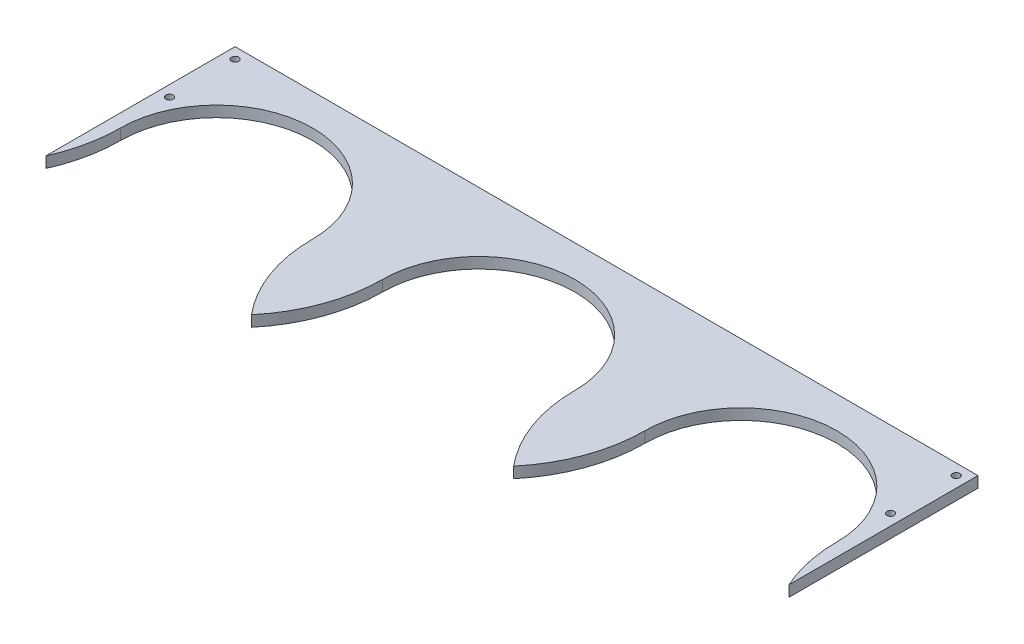
ISO-10303-21;
HEADER;
FILE_DESCRIPTION(('STEP AP214'),'2;1');
FILE_NAME('part.step','',(''),(''),'','','');
FILE_SCHEMA(('AUTOMOTIVE_DESIGN { 1 0 10303 214 1 1 1 1 }'));
ENDSEC;
DATA;
#1=APPLICATION_CONTEXT('core data for automotive mechanical design processes');
#2=APPLICATION_PROTOCOL_DEFINITION('international standard','automotive_design',2000,#1);
#3=PRODUCT_CONTEXT('',#1,'mechanical');
#4=PRODUCT('Part','Part','',(#3));
#5=PRODUCT_RELATED_PRODUCT_CATEGORY('part','',(#4));
#6=PRODUCT_DEFINITION_FORMATION('','',#4);
#7=PRODUCT_DEFINITION_CONTEXT('part definition',#1,'design');
#8=PRODUCT_DEFINITION('design','',#6,#7);
#9=PRODUCT_DEFINITION_SHAPE('','',#8);
#10=(LENGTH_UNIT() NAMED_UNIT(*) SI_UNIT(.MILLI.,.METRE.));
#11=(NAMED_UNIT(*) PLANE_ANGLE_UNIT() SI_UNIT($,.RADIAN.));
#12=(NAMED_UNIT(*) SI_UNIT($,.STERADIAN.) SOLID_ANGLE_UNIT());
#13=UNCERTAINTY_MEASURE_WITH_UNIT(LENGTH_MEASURE(1.E-05),#10,'distance_accuracy_value','');
#14=(GEOMETRIC_REPRESENTATION_CONTEXT(3) GLOBAL_UNCERTAINTY_ASSIGNED_CONTEXT((#13)) GLOBAL_UNIT_ASSIGNED_CONTEXT((#10,
#11,#12)) REPRESENTATION_CONTEXT('',''));
#15=CARTESIAN_POINT('',(0.,0.,0.));
#16=DIRECTION('',(0.,0.,1.));
#17=DIRECTION('',(1.,0.,0.));
#18=AXIS2_PLACEMENT_3D('',#15,#16,#17);
#19=CARTESIAN_POINT('',(76.2,-6.35,74.295));
#20=DIRECTION('',(0.,1.,0.));
#21=DIRECTION('',(0.,0.,1.));
#22=AXIS2_PLACEMENT_3D('',#19,#20,#21);
#23=CYLINDRICAL_SURFACE('',#22,55.88);
#24=CARTESIAN_POINT('',(76.2,0.,74.295));
#25=DIRECTION('',(0.,1.,0.));
#26=DIRECTION('',(0.,0.,1.));
#27=AXIS2_PLACEMENT_3D('',#24,#25,#26);
#28=CIRCLE('',#27,55.88);
#29=CARTESIAN_POINT('',(132.08,0.,74.295));
#30=VERTEX_POINT('',#29);
#31=CARTESIAN_POINT('',(20.32,0.,74.2949999999999));
#32=VERTEX_POINT('',#31);
#33=EDGE_CURVE('E170',#30,#32,#28,.T.);
#34=ORIENTED_EDGE('',*,*,#33,.T.);
#35=DIRECTION('',(0.,1.,0.));
#36=VECTOR('',#35,1.);
#37=CARTESIAN_POINT('',(20.32,-6.35,74.2949999999999));
#38=LINE('',#37,#36);
#39=CARTESIAN_POINT('',(20.32,-6.35,74.2949999999999));
#40=VERTEX_POINT('',#39);
#41=EDGE_CURVE('E11',#40,#32,#38,.T.);
#42=ORIENTED_EDGE('',*,*,#41,.F.);
#43=CARTESIAN_POINT('',(76.2,-6.35,74.295));
#44=DIRECTION('',(0.,1.,0.));
#45=DIRECTION('',(0.,0.,1.));
#46=AXIS2_PLACEMENT_3D('',#43,#44,#45);
#47=CIRCLE('',#46,55.88);
#48=CARTESIAN_POINT('',(132.08,-6.35,74.295));
#49=VERTEX_POINT('',#48);
#50=EDGE_CURVE('E54',#49,#40,#47,.T.);
#51=ORIENTED_EDGE('',*,*,#50,.F.);
#52=DIRECTION('',(0.,1.,0.));
#53=VECTOR('',#52,1.);
#54=CARTESIAN_POINT('',(132.08,-6.35,74.295));
#55=LINE('',#54,#53);
#56=EDGE_CURVE('E39',#49,#30,#55,.T.);
#57=ORIENTED_EDGE('',*,*,#56,.T.);
#58=EDGE_LOOP('',(#34,#42,#51,#57));
#59=FACE_BOUND('',#58,.T.);
#60=ADVANCED_FACE('F35',(#59),#23,.F.);
#61=CARTESIAN_POINT('',(-66.6750000000003,-6.35,74.2949999999999));
#62=DIRECTION('',(0.,1.,0.));
#63=DIRECTION('',(0.,0.,1.));
#64=AXIS2_PLACEMENT_3D('',#61,#62,#63);
#65=CYLINDRICAL_SURFACE('',#64,86.9950000000003);
#66=CARTESIAN_POINT('',(-66.6750000000003,0.,74.2949999999999));
#67=DIRECTION('',(0.,1.,0.));
#68=DIRECTION('',(0.,0.,1.));
#69=AXIS2_PLACEMENT_3D('',#66,#67,#68);
#70=CIRCLE('',#69,86.9950000000003);
#71=CARTESIAN_POINT('',(12.7,0.,109.900328252945));
#72=VERTEX_POINT('',#71);
#73=EDGE_CURVE('E198',#72,#32,#70,.T.);
#74=ORIENTED_EDGE('',*,*,#73,.F.);
#75=DIRECTION('',(0.,1.,0.));
#76=VECTOR('',#75,1.);
#77=CARTESIAN_POINT('',(12.7,-6.35,109.900328252945));
#78=LINE('',#77,#76);
#79=CARTESIAN_POINT('',(12.7,-6.35,109.900328252945));
#80=VERTEX_POINT('',#79);
#81=EDGE_CURVE('E45',#80,#72,#78,.T.);
#82=ORIENTED_EDGE('',*,*,#81,.F.);
#83=CARTESIAN_POINT('',(-66.6750000000003,-6.35,74.2949999999999));
#84=DIRECTION('',(0.,1.,0.));
#85=DIRECTION('',(0.,0.,1.));
#86=AXIS2_PLACEMENT_3D('',#83,#84,#85);
#87=CIRCLE('',#86,86.9950000000003);
#88=EDGE_CURVE('E138',#80,#40,#87,.T.);
#89=ORIENTED_EDGE('',*,*,#88,.T.);
#90=ORIENTED_EDGE('',*,*,#41,.T.);
#91=EDGE_LOOP('',(#74,#82,#89,#90));
#92=FACE_BOUND('',#91,.T.);
#93=ADVANCED_FACE('F245',(#92),#65,.T.);
#94=CARTESIAN_POINT('',(12.7,-6.35,19.0511066702807));
#95=DIRECTION('',(1.,0.,0.));
#96=DIRECTION('',(0.,0.,-1.));
#97=AXIS2_PLACEMENT_3D('',#94,#95,#96);
#98=PLANE('',#97);
#99=DIRECTION('',(0.,0.,-1.));
#100=VECTOR('',#99,1.);
#101=CARTESIAN_POINT('',(12.7,0.,19.0511066702807));
#102=LINE('',#101,#100);
#103=CARTESIAN_POINT('',(12.7,0.,0.));
#104=VERTEX_POINT('',#103);
#105=EDGE_CURVE('E143',#72,#104,#102,.T.);
#106=ORIENTED_EDGE('',*,*,#105,.T.);
#107=DIRECTION('',(0.,1.,0.));
#108=VECTOR('',#107,1.);
#109=CARTESIAN_POINT('',(12.7,-6.35,0.));
#110=LINE('',#109,#108);
#111=CARTESIAN_POINT('',(12.7,-6.35,0.));
#112=VERTEX_POINT('',#111);
#113=EDGE_CURVE('E141',#112,#104,#110,.T.);
#114=ORIENTED_EDGE('',*,*,#113,.F.);
#115=DIRECTION('',(0.,0.,-1.));
#116=VECTOR('',#115,1.);
#117=CARTESIAN_POINT('',(12.7,-6.35,19.0511066702807));
#118=LINE('',#117,#116);
#119=EDGE_CURVE('E130',#80,#112,#118,.T.);
#120=ORIENTED_EDGE('',*,*,#119,.F.);
#121=ORIENTED_EDGE('',*,*,#81,.T.);
#122=EDGE_LOOP('',(#106,#114,#120,#121));
#123=FACE_BOUND('',#122,.T.);
#124=ADVANCED_FACE('F142',(#123),#98,.F.);
#125=CARTESIAN_POINT('',(-166.949667095229,-6.35,0.));
#126=DIRECTION('',(0.,0.,1.));
#127=DIRECTION('',(1.,0.,0.));
#128=AXIS2_PLACEMENT_3D('',#125,#126,#127);
#129=PLANE('',#128);
#130=DIRECTION('',(1.,0.,0.));
#131=VECTOR('',#130,1.);
#132=CARTESIAN_POINT('',(-166.949667095229,0.,0.));
#133=LINE('',#132,#131);
#134=CARTESIAN_POINT('',(444.5,0.,0.));
#135=VERTEX_POINT('',#134);
#136=EDGE_CURVE('E195',#104,#135,#133,.T.);
#137=ORIENTED_EDGE('',*,*,#136,.T.);
#138=DIRECTION('',(0.,1.,0.));
#139=VECTOR('',#138,1.);
#140=CARTESIAN_POINT('',(444.5,-6.35,0.));
#141=LINE('',#140,#139);
#142=CARTESIAN_POINT('',(444.5,-6.35,0.));
#143=VERTEX_POINT('',#142);
#144=EDGE_CURVE('E147',#143,#135,#141,.T.);
#145=ORIENTED_EDGE('',*,*,#144,.F.);
#146=DIRECTION('',(1.,0.,0.));
#147=VECTOR('',#146,1.);
#148=CARTESIAN_POINT('',(-166.949667095229,-6.35,0.));
#149=LINE('',#148,#147);
#150=EDGE_CURVE('E136',#112,#143,#149,.T.);
#151=ORIENTED_EDGE('',*,*,#150,.F.);
#152=ORIENTED_EDGE('',*,*,#113,.T.);
#153=EDGE_LOOP('',(#137,#145,#151,#152));
#154=FACE_BOUND('',#153,.T.);
#155=ADVANCED_FACE('F149',(#154),#129,.F.);
#156=CARTESIAN_POINT('',(444.5,-6.35,19.0511066702807));
#157=DIRECTION('',(1.,0.,0.));
#158=DIRECTION('',(0.,0.,-1.));
#159=AXIS2_PLACEMENT_3D('',#156,#157,#158);
#160=PLANE('',#159);
#161=DIRECTION('',(0.,0.,-1.));
#162=VECTOR('',#161,1.);
#163=CARTESIAN_POINT('',(444.5,0.,19.0511066702807));
#164=LINE('',#163,#162);
#165=CARTESIAN_POINT('',(444.5,0.,109.900328252945));
#166=VERTEX_POINT('',#165);
#167=EDGE_CURVE('E192',#166,#135,#164,.T.);
#168=ORIENTED_EDGE('',*,*,#167,.F.);
#169=DIRECTION('',(0.,1.,0.));
#170=VECTOR('',#169,1.);
#171=CARTESIAN_POINT('',(444.5,-6.35,109.900328252945));
#172=LINE('',#171,#170);
#173=CARTESIAN_POINT('',(444.5,-6.35,109.900328252945));
#174=VERTEX_POINT('',#173);
#175=EDGE_CURVE('E210',#174,#166,#172,.T.);
#176=ORIENTED_EDGE('',*,*,#175,.F.);
#177=DIRECTION('',(0.,0.,-1.));
#178=VECTOR('',#177,1.);
#179=CARTESIAN_POINT('',(444.5,-6.35,19.0511066702807));
#180=LINE('',#179,#178);
#181=EDGE_CURVE('E151',#174,#143,#180,.T.);
#182=ORIENTED_EDGE('',*,*,#181,.T.);
#183=ORIENTED_EDGE('',*,*,#144,.T.);
#184=EDGE_LOOP('',(#168,#176,#182,#183));
#185=FACE_BOUND('',#184,.T.);
#186=ADVANCED_FACE('F258',(#185),#160,.T.);
#187=CARTESIAN_POINT('',(523.874999999999,-6.35,74.2950000000002));
#188=DIRECTION('',(0.,1.,0.));
#189=DIRECTION('',(0.,0.,1.));
#190=AXIS2_PLACEMENT_3D('',#187,#188,#189);
#191=CYLINDRICAL_SURFACE('',#190,86.9949999999992);
#192=CARTESIAN_POINT('',(523.874999999999,0.,74.2950000000002));
#193=DIRECTION('',(0.,1.,0.));
#194=DIRECTION('',(0.,0.,1.));
#195=AXIS2_PLACEMENT_3D('',#192,#193,#194);
#196=CIRCLE('',#195,86.9949999999992);
#197=CARTESIAN_POINT('',(436.88,0.,74.2950000000001));
#198=VERTEX_POINT('',#197);
#199=EDGE_CURVE('E189',#198,#166,#196,.T.);
#200=ORIENTED_EDGE('',*,*,#199,.F.);
#201=DIRECTION('',(0.,1.,0.));
#202=VECTOR('',#201,1.);
#203=CARTESIAN_POINT('',(436.88,-6.35,74.2950000000001));
#204=LINE('',#203,#202);
#205=CARTESIAN_POINT('',(436.88,-6.35,74.2950000000001));
#206=VERTEX_POINT('',#205);
#207=EDGE_CURVE('E212',#206,#198,#204,.T.);
#208=ORIENTED_EDGE('',*,*,#207,.F.);
#209=CARTESIAN_POINT('',(523.874999999999,-6.35,74.2950000000002));
#210=DIRECTION('',(0.,1.,0.));
#211=DIRECTION('',(0.,0.,1.));
#212=AXIS2_PLACEMENT_3D('',#209,#210,#211);
#213=CIRCLE('',#212,86.9949999999992);
#214=EDGE_CURVE('E153',#206,#174,#213,.T.);
#215=ORIENTED_EDGE('',*,*,#214,.T.);
#216=ORIENTED_EDGE('',*,*,#175,.T.);
#217=EDGE_LOOP('',(#200,#208,#215,#216));
#218=FACE_BOUND('',#217,.T.);
#219=ADVANCED_FACE('F261',(#218),#191,.T.);
#220=CARTESIAN_POINT('',(381.,-6.35,74.295));
#221=DIRECTION('',(0.,1.,0.));
#222=DIRECTION('',(0.,0.,1.));
#223=AXIS2_PLACEMENT_3D('',#220,#221,#222);
#224=CYLINDRICAL_SURFACE('',#223,55.88);
#225=CARTESIAN_POINT('',(381.,0.,74.295));
#226=DIRECTION('',(0.,1.,0.));
#227=DIRECTION('',(0.,0.,1.));
#228=AXIS2_PLACEMENT_3D('',#225,#226,#227);
#229=CIRCLE('',#228,55.88);
#230=CARTESIAN_POINT('',(325.12,0.,74.2950000000001));
#231=VERTEX_POINT('',#230);
#232=EDGE_CURVE('E187',#198,#231,#229,.T.);
#233=ORIENTED_EDGE('',*,*,#232,.T.);
#234=DIRECTION('',(0.,1.,0.));
#235=VECTOR('',#234,1.);
#236=CARTESIAN_POINT('',(325.12,-6.35,74.2950000000001));
#237=LINE('',#236,#235);
#238=CARTESIAN_POINT('',(325.12,-6.35,74.2950000000001));
#239=VERTEX_POINT('',#238);
#240=EDGE_CURVE('E214',#239,#231,#237,.T.);
#241=ORIENTED_EDGE('',*,*,#240,.F.);
#242=CARTESIAN_POINT('',(381.,-6.35,74.295));
#243=DIRECTION('',(0.,1.,0.));
#244=DIRECTION('',(0.,0.,1.));
#245=AXIS2_PLACEMENT_3D('',#242,#243,#244);
#246=CIRCLE('',#245,55.88);
#247=EDGE_CURVE('E304',#206,#239,#246,.T.);
#248=ORIENTED_EDGE('',*,*,#247,.F.);
#249=ORIENTED_EDGE('',*,*,#207,.T.);
#250=EDGE_LOOP('',(#233,#241,#248,#249));
#251=FACE_BOUND('',#250,.T.);
#252=ADVANCED_FACE('F265',(#251),#224,.F.);
#253=CARTESIAN_POINT('',(238.125000000001,-6.35,74.2950000000002));
#254=DIRECTION('',(0.,1.,0.));
#255=DIRECTION('',(0.,0.,1.));
#256=AXIS2_PLACEMENT_3D('',#253,#254,#255);
#257=CYLINDRICAL_SURFACE('',#256,86.9949999999994);
#258=CARTESIAN_POINT('',(238.125000000001,0.,74.2950000000002));
#259=DIRECTION('',(0.,1.,0.));
#260=DIRECTION('',(0.,0.,1.));
#261=AXIS2_PLACEMENT_3D('',#258,#259,#260);
#262=CIRCLE('',#261,86.9949999999994);
#263=CARTESIAN_POINT('',(304.8,0.,130.175));
#264=VERTEX_POINT('',#263);
#265=EDGE_CURVE('E184',#231,#264,#262,.F.);
#266=ORIENTED_EDGE('',*,*,#265,.T.);
#267=DIRECTION('',(0.,1.,0.));
#268=VECTOR('',#267,1.);
#269=CARTESIAN_POINT('',(304.8,-6.35,130.175));
#270=LINE('',#269,#268);
#271=CARTESIAN_POINT('',(304.8,-6.35,130.175));
#272=VERTEX_POINT('',#271);
#273=EDGE_CURVE('E217',#272,#264,#270,.T.);
#274=ORIENTED_EDGE('',*,*,#273,.F.);
#275=CARTESIAN_POINT('',(238.125000000001,-6.35,74.2950000000002));
#276=DIRECTION('',(0.,1.,0.));
#277=DIRECTION('',(0.,0.,1.));
#278=AXIS2_PLACEMENT_3D('',#275,#276,#277);
#279=CIRCLE('',#278,86.9949999999994);
#280=EDGE_CURVE('E305',#239,#272,#279,.F.);
#281=ORIENTED_EDGE('',*,*,#280,.F.);
#282=ORIENTED_EDGE('',*,*,#240,.T.);
#283=EDGE_LOOP('',(#266,#274,#281,#282));
#284=FACE_BOUND('',#283,.T.);
#285=ADVANCED_FACE('F269',(#284),#257,.T.);
#286=CARTESIAN_POINT('',(371.475,-6.35,74.2950000000002));
#287=DIRECTION('',(0.,1.,0.));
#288=DIRECTION('',(0.,0.,1.));
#289=AXIS2_PLACEMENT_3D('',#286,#287,#288);
#290=CYLINDRICAL_SURFACE('',#289,86.9949999999995);
#291=CARTESIAN_POINT('',(371.475,0.,74.2950000000002));
#292=DIRECTION('',(0.,1.,0.));
#293=DIRECTION('',(0.,0.,1.));
#294=AXIS2_PLACEMENT_3D('',#291,#292,#293);
#295=CIRCLE('',#294,86.9949999999995);
#296=CARTESIAN_POINT('',(284.48,0.,74.2950000000001));
#297=VERTEX_POINT('',#296);
#298=EDGE_CURVE('E181',#297,#264,#295,.T.);
#299=ORIENTED_EDGE('',*,*,#298,.F.);
#300=DIRECTION('',(0.,1.,0.));
#301=VECTOR('',#300,1.);
#302=CARTESIAN_POINT('',(284.48,-6.35,74.2950000000001));
#303=LINE('',#302,#301);
#304=CARTESIAN_POINT('',(284.48,-6.35,74.2950000000001));
#305=VERTEX_POINT('',#304);
#306=EDGE_CURVE('E219',#305,#297,#303,.T.);
#307=ORIENTED_EDGE('',*,*,#306,.F.);
#308=CARTESIAN_POINT('',(371.475,-6.35,74.2950000000002));
#309=DIRECTION('',(0.,1.,0.));
#310=DIRECTION('',(0.,0.,1.));
#311=AXIS2_PLACEMENT_3D('',#308,#309,#310);
#312=CIRCLE('',#311,86.9949999999995);
#313=EDGE_CURVE('E295',#305,#272,#312,.T.);
#314=ORIENTED_EDGE('',*,*,#313,.T.);
#315=ORIENTED_EDGE('',*,*,#273,.T.);
#316=EDGE_LOOP('',(#299,#307,#314,#315));
#317=FACE_BOUND('',#316,.T.);
#318=ADVANCED_FACE('F273',(#317),#290,.T.);
#319=CARTESIAN_POINT('',(228.6,-6.35,74.295));
#320=DIRECTION('',(0.,1.,0.));
#321=DIRECTION('',(0.,0.,1.));
#322=AXIS2_PLACEMENT_3D('',#319,#320,#321);
#323=CYLINDRICAL_SURFACE('',#322,55.88);
#324=CARTESIAN_POINT('',(228.6,0.,74.295));
#325=DIRECTION('',(0.,1.,0.));
#326=DIRECTION('',(0.,0.,1.));
#327=AXIS2_PLACEMENT_3D('',#324,#325,#326);
#328=CIRCLE('',#327,55.88);
#329=CARTESIAN_POINT('',(172.72,0.,74.2949999999999));
#330=VERTEX_POINT('',#329);
#331=EDGE_CURVE('E178',#297,#330,#328,.T.);
#332=ORIENTED_EDGE('',*,*,#331,.T.);
#333=DIRECTION('',(0.,1.,0.));
#334=VECTOR('',#333,1.);
#335=CARTESIAN_POINT('',(172.72,-6.35,74.2949999999999));
#336=LINE('',#335,#334);
#337=CARTESIAN_POINT('',(172.72,-6.35,74.2949999999999));
#338=VERTEX_POINT('',#337);
#339=EDGE_CURVE('E221',#338,#330,#336,.T.);
#340=ORIENTED_EDGE('',*,*,#339,.F.);
#341=CARTESIAN_POINT('',(228.6,-6.35,74.295));
#342=DIRECTION('',(0.,1.,0.));
#343=DIRECTION('',(0.,0.,1.));
#344=AXIS2_PLACEMENT_3D('',#341,#342,#343);
#345=CIRCLE('',#344,55.88);
#346=EDGE_CURVE('E310',#305,#338,#345,.T.);
#347=ORIENTED_EDGE('',*,*,#346,.F.);
#348=ORIENTED_EDGE('',*,*,#306,.T.);
#349=EDGE_LOOP('',(#332,#340,#347,#348));
#350=FACE_BOUND('',#349,.T.);
#351=ADVANCED_FACE('F277',(#350),#323,.F.);
#352=CARTESIAN_POINT('',(85.7249999999997,-6.35,74.2949999999999));
#353=DIRECTION('',(0.,1.,0.));
#354=DIRECTION('',(0.,0.,1.));
#355=AXIS2_PLACEMENT_3D('',#352,#353,#354);
#356=CYLINDRICAL_SURFACE('',#355,86.9950000000003);
#357=CARTESIAN_POINT('',(85.7249999999997,0.,74.2949999999999));
#358=DIRECTION('',(0.,1.,0.));
#359=DIRECTION('',(0.,0.,1.));
#360=AXIS2_PLACEMENT_3D('',#357,#358,#359);
#361=CIRCLE('',#360,86.9950000000003);
#362=CARTESIAN_POINT('',(152.4,0.,130.175));
#363=VERTEX_POINT('',#362);
#364=EDGE_CURVE('E175',#363,#330,#361,.T.);
#365=ORIENTED_EDGE('',*,*,#364,.F.);
#366=DIRECTION('',(0.,1.,0.));
#367=VECTOR('',#366,1.);
#368=CARTESIAN_POINT('',(152.4,-6.35,130.175));
#369=LINE('',#368,#367);
#370=CARTESIAN_POINT('',(152.4,-6.35,130.175));
#371=VERTEX_POINT('',#370);
#372=EDGE_CURVE('E222',#371,#363,#369,.T.);
#373=ORIENTED_EDGE('',*,*,#372,.F.);
#374=CARTESIAN_POINT('',(85.7249999999997,-6.35,74.2949999999999));
#375=DIRECTION('',(0.,1.,0.));
#376=DIRECTION('',(0.,0.,1.));
#377=AXIS2_PLACEMENT_3D('',#374,#375,#376);
#378=CIRCLE('',#377,86.9950000000003);
#379=EDGE_CURVE('E312',#371,#338,#378,.T.);
#380=ORIENTED_EDGE('',*,*,#379,.T.);
#381=ORIENTED_EDGE('',*,*,#339,.T.);
#382=EDGE_LOOP('',(#365,#373,#380,#381));
#383=FACE_BOUND('',#382,.T.);
#384=ADVANCED_FACE('F239',(#383),#356,.T.);
#385=CARTESIAN_POINT('',(438.15,-6.35,44.45));
#386=DIRECTION('',(0.,1.,0.));
#387=DIRECTION('',(0.,0.,1.));
#388=AXIS2_PLACEMENT_3D('',#385,#386,#387);
#389=CYLINDRICAL_SURFACE('',#388,2.12089999999999);
#390=CARTESIAN_POINT('',(438.15,-6.35,44.45));
#391=DIRECTION('',(0.,1.,0.));
#392=DIRECTION('',(0.,0.,1.));
#393=AXIS2_PLACEMENT_3D('',#390,#391,#392);
#394=CIRCLE('',#393,2.12089999999999);
#395=CARTESIAN_POINT('',(438.15,-6.35,46.5709));
#396=VERTEX_POINT('',#395);
#397=EDGE_CURVE('E158',#396,#396,#394,.T.);
#398=ORIENTED_EDGE('',*,*,#397,.F.);
#399=EDGE_LOOP('',(#398));
#400=FACE_BOUND('',#399,.T.);
#401=CARTESIAN_POINT('',(438.15,0.,44.45));
#402=DIRECTION('',(0.,1.,0.));
#403=DIRECTION('',(0.,0.,1.));
#404=AXIS2_PLACEMENT_3D('',#401,#402,#403);
#405=CIRCLE('',#404,2.12089999999999);
#406=CARTESIAN_POINT('',(438.15,0.,46.5709));
#407=VERTEX_POINT('',#406);
#408=EDGE_CURVE('E201',#407,#407,#405,.T.);
#409=ORIENTED_EDGE('',*,*,#408,.T.);
#410=EDGE_LOOP('',(#409));
#411=FACE_BOUND('',#410,.T.);
#412=ADVANCED_FACE('F232',(#400,#411),#389,.F.);
#413=CARTESIAN_POINT('',(219.075,-6.35,74.2949999999999));
#414=DIRECTION('',(0.,1.,0.));
#415=DIRECTION('',(0.,0.,1.));
#416=AXIS2_PLACEMENT_3D('',#413,#414,#415);
#417=CYLINDRICAL_SURFACE('',#416,86.9950000000003);
#418=CARTESIAN_POINT('',(219.075,0.,74.2949999999999));
#419=DIRECTION('',(0.,1.,0.));
#420=DIRECTION('',(0.,0.,1.));
#421=AXIS2_PLACEMENT_3D('',#418,#419,#420);
#422=CIRCLE('',#421,86.9950000000003);
#423=EDGE_CURVE('E172',#30,#363,#422,.T.);
#424=ORIENTED_EDGE('',*,*,#423,.F.);
#425=ORIENTED_EDGE('',*,*,#56,.F.);
#426=CARTESIAN_POINT('',(219.075,-6.35,74.2949999999999));
#427=DIRECTION('',(0.,1.,0.));
#428=DIRECTION('',(0.,0.,1.));
#429=AXIS2_PLACEMENT_3D('',#426,#427,#428);
#430=CIRCLE('',#429,86.9950000000003);
#431=EDGE_CURVE('E314',#49,#371,#430,.T.);
#432=ORIENTED_EDGE('',*,*,#431,.T.);
#433=ORIENTED_EDGE('',*,*,#372,.T.);
#434=EDGE_LOOP('',(#424,#425,#432,#433));
#435=FACE_BOUND('',#434,.T.);
#436=ADVANCED_FACE('F229',(#435),#417,.T.);
#437=CARTESIAN_POINT('',(19.05,-6.35,6.34999999999999));
#438=DIRECTION('',(0.,1.,0.));
#439=DIRECTION('',(0.,0.,1.));
#440=AXIS2_PLACEMENT_3D('',#437,#438,#439);
#441=CYLINDRICAL_SURFACE('',#440,2.12089999999999);
#442=CARTESIAN_POINT('',(19.05,-6.35,6.34999999999999));
#443=DIRECTION('',(0.,1.,0.));
#444=DIRECTION('',(0.,0.,1.));
#445=AXIS2_PLACEMENT_3D('',#442,#443,#444);
#446=CIRCLE('',#445,2.12089999999999);
#447=CARTESIAN_POINT('',(19.05,-6.35,8.47089999999998));
#448=VERTEX_POINT('',#447);
#449=EDGE_CURVE('E317',#448,#448,#446,.T.);
#450=ORIENTED_EDGE('',*,*,#449,.F.);
#451=EDGE_LOOP('',(#450));
#452=FACE_BOUND('',#451,.T.);
#453=CARTESIAN_POINT('',(19.05,0.,6.34999999999999));
#454=DIRECTION('',(0.,1.,0.));
#455=DIRECTION('',(0.,0.,1.));
#456=AXIS2_PLACEMENT_3D('',#453,#454,#455);
#457=CIRCLE('',#456,2.12089999999999);
#458=CARTESIAN_POINT('',(19.05,0.,8.47089999999998));
#459=VERTEX_POINT('',#458);
#460=EDGE_CURVE('E167',#459,#459,#457,.T.);
#461=ORIENTED_EDGE('',*,*,#460,.T.);
#462=EDGE_LOOP('',(#461));
#463=FACE_BOUND('',#462,.T.);
#464=ADVANCED_FACE('F231',(#452,#463),#441,.F.);
#465=CARTESIAN_POINT('',(19.05,-6.35,44.45));
#466=DIRECTION('',(0.,1.,0.));
#467=DIRECTION('',(0.,0.,1.));
#468=AXIS2_PLACEMENT_3D('',#465,#466,#467);
#469=CYLINDRICAL_SURFACE('',#468,2.12089999999999);
#470=CARTESIAN_POINT('',(19.05,-6.35,44.45));
#471=DIRECTION('',(0.,1.,0.));
#472=DIRECTION('',(0.,0.,1.));
#473=AXIS2_PLACEMENT_3D('',#470,#471,#472);
#474=CIRCLE('',#473,2.12089999999999);
#475=CARTESIAN_POINT('',(19.05,-6.35,46.5709));
#476=VERTEX_POINT('',#475);
#477=EDGE_CURVE('E206',#476,#476,#474,.T.);
#478=ORIENTED_EDGE('',*,*,#477,.F.);
#479=EDGE_LOOP('',(#478));
#480=FACE_BOUND('',#479,.T.);
#481=CARTESIAN_POINT('',(19.05,0.,44.45));
#482=DIRECTION('',(0.,1.,0.));
#483=DIRECTION('',(0.,0.,1.));
#484=AXIS2_PLACEMENT_3D('',#481,#482,#483);
#485=CIRCLE('',#484,2.12089999999999);
#486=CARTESIAN_POINT('',(19.05,0.,46.5709));
#487=VERTEX_POINT('',#486);
#488=EDGE_CURVE('E164',#487,#487,#485,.T.);
#489=ORIENTED_EDGE('',*,*,#488,.T.);
#490=EDGE_LOOP('',(#489));
#491=FACE_BOUND('',#490,.T.);
#492=ADVANCED_FACE('F37',(#480,#491),#469,.F.);
#493=CARTESIAN_POINT('',(438.15,-6.35,6.35));
#494=DIRECTION('',(0.,1.,0.));
#495=DIRECTION('',(0.,0.,1.));
#496=AXIS2_PLACEMENT_3D('',#493,#494,#495);
#497=CYLINDRICAL_SURFACE('',#496,2.12089999999999);
#498=CARTESIAN_POINT('',(438.15,-6.35,6.35));
#499=DIRECTION('',(0.,1.,0.));
#500=DIRECTION('',(0.,0.,1.));
#501=AXIS2_PLACEMENT_3D('',#498,#499,#500);
#502=CIRCLE('',#501,2.12089999999999);
#503=CARTESIAN_POINT('',(438.15,-6.35,8.47089999999999));
#504=VERTEX_POINT('',#503);
#505=EDGE_CURVE('E161',#504,#504,#502,.T.);
#506=ORIENTED_EDGE('',*,*,#505,.F.);
#507=EDGE_LOOP('',(#506));
#508=FACE_BOUND('',#507,.T.);
#509=CARTESIAN_POINT('',(438.15,0.,6.35));
#510=DIRECTION('',(0.,1.,0.));
#511=DIRECTION('',(0.,0.,1.));
#512=AXIS2_PLACEMENT_3D('',#509,#510,#511);
#513=CIRCLE('',#512,2.12089999999999);
#514=CARTESIAN_POINT('',(438.15,0.,8.47089999999999));
#515=VERTEX_POINT('',#514);
#516=EDGE_CURVE('E204',#515,#515,#513,.T.);
#517=ORIENTED_EDGE('',*,*,#516,.T.);
#518=EDGE_LOOP('',(#517));
#519=FACE_BOUND('',#518,.T.);
#520=ADVANCED_FACE('F327',(#508,#519),#497,.F.);
#521=CARTESIAN_POINT('',(-166.949667095229,-6.35,19.0511066702807));
#522=DIRECTION('',(0.,1.,0.));
#523=DIRECTION('',(0.,0.,1.));
#524=AXIS2_PLACEMENT_3D('',#521,#522,#523);
#525=PLANE('',#524);
#526=ORIENTED_EDGE('',*,*,#477,.T.);
#527=EDGE_LOOP('',(#526));
#528=FACE_BOUND('',#527,.T.);
#529=ORIENTED_EDGE('',*,*,#449,.T.);
#530=EDGE_LOOP('',(#529));
#531=FACE_BOUND('',#530,.T.);
#532=ORIENTED_EDGE('',*,*,#50,.T.);
#533=ORIENTED_EDGE('',*,*,#88,.F.);
#534=ORIENTED_EDGE('',*,*,#119,.T.);
#535=ORIENTED_EDGE('',*,*,#150,.T.);
#536=ORIENTED_EDGE('',*,*,#181,.F.);
#537=ORIENTED_EDGE('',*,*,#214,.F.);
#538=ORIENTED_EDGE('',*,*,#247,.T.);
#539=ORIENTED_EDGE('',*,*,#280,.T.);
#540=ORIENTED_EDGE('',*,*,#313,.F.);
#541=ORIENTED_EDGE('',*,*,#346,.T.);
#542=ORIENTED_EDGE('',*,*,#379,.F.);
#543=ORIENTED_EDGE('',*,*,#431,.F.);
#544=EDGE_LOOP('',(#532,#533,#534,#535,#536,#537,#538,#539,#540,#541,#542,#543));
#545=FACE_BOUND('',#544,.T.);
#546=ORIENTED_EDGE('',*,*,#397,.T.);
#547=EDGE_LOOP('',(#546));
#548=FACE_BOUND('',#547,.T.);
#549=ORIENTED_EDGE('',*,*,#505,.T.);
#550=EDGE_LOOP('',(#549));
#551=FACE_BOUND('',#550,.T.);
#552=ADVANCED_FACE('F132',(#528,#531,#545,#548,#551),#525,.F.);
#553=CARTESIAN_POINT('',(-166.949667095229,0.,19.0511066702807));
#554=DIRECTION('',(0.,1.,0.));
#555=DIRECTION('',(0.,0.,1.));
#556=AXIS2_PLACEMENT_3D('',#553,#554,#555);
#557=PLANE('',#556);
#558=ORIENTED_EDGE('',*,*,#488,.F.);
#559=EDGE_LOOP('',(#558));
#560=FACE_BOUND('',#559,.T.);
#561=ORIENTED_EDGE('',*,*,#460,.F.);
#562=EDGE_LOOP('',(#561));
#563=FACE_BOUND('',#562,.T.);
#564=ORIENTED_EDGE('',*,*,#33,.F.);
#565=ORIENTED_EDGE('',*,*,#423,.T.);
#566=ORIENTED_EDGE('',*,*,#364,.T.);
#567=ORIENTED_EDGE('',*,*,#331,.F.);
#568=ORIENTED_EDGE('',*,*,#298,.T.);
#569=ORIENTED_EDGE('',*,*,#265,.F.);
#570=ORIENTED_EDGE('',*,*,#232,.F.);
#571=ORIENTED_EDGE('',*,*,#199,.T.);
#572=ORIENTED_EDGE('',*,*,#167,.T.);
#573=ORIENTED_EDGE('',*,*,#136,.F.);
#574=ORIENTED_EDGE('',*,*,#105,.F.);
#575=ORIENTED_EDGE('',*,*,#73,.T.);
#576=EDGE_LOOP('',(#564,#565,#566,#567,#568,#569,#570,#571,#572,#573,#574,#575));
#577=FACE_BOUND('',#576,.T.);
#578=ORIENTED_EDGE('',*,*,#408,.F.);
#579=EDGE_LOOP('',(#578));
#580=FACE_BOUND('',#579,.T.);
#581=ORIENTED_EDGE('',*,*,#516,.F.);
#582=EDGE_LOOP('',(#581));
#583=FACE_BOUND('',#582,.T.);
#584=ADVANCED_FACE('F227',(#560,#563,#577,#580,#583),#557,.T.);
#585=CLOSED_SHELL('',(#60,#93,#124,#155,#186,#219,#252,#285,#318,#351,#384,#412,#436,#464,#492,
#520,#552,#584));
#586=MANIFOLD_SOLID_BREP('B2',#585);
#587=ADVANCED_BREP_SHAPE_REPRESENTATION('',(#18,#586),#14);
#588=SHAPE_DEFINITION_REPRESENTATION(#9,#587);
ENDSEC;
END-ISO-10303-21;
